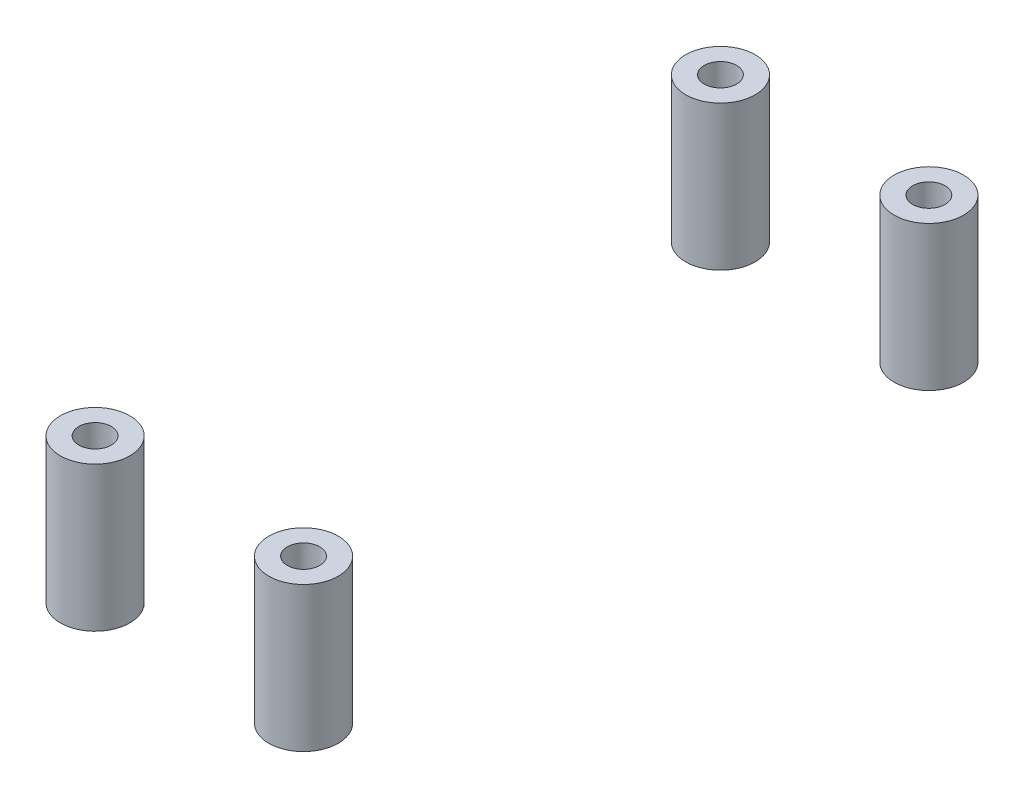
ISO-10303-21;
HEADER;
FILE_DESCRIPTION(('STEP AP214'),'2;1');
FILE_NAME('part.step','',(''),(''),'','','');
FILE_SCHEMA(('AUTOMOTIVE_DESIGN { 1 0 10303 214 1 1 1 1 }'));
ENDSEC;
DATA;
#1=APPLICATION_CONTEXT('core data for automotive mechanical design processes');
#2=APPLICATION_PROTOCOL_DEFINITION('international standard','automotive_design',2000,#1);
#3=PRODUCT_CONTEXT('',#1,'mechanical');
#4=PRODUCT('Part','Part','',(#3));
#5=PRODUCT_RELATED_PRODUCT_CATEGORY('part','',(#4));
#6=PRODUCT_DEFINITION_FORMATION('','',#4);
#7=PRODUCT_DEFINITION_CONTEXT('part definition',#1,'design');
#8=PRODUCT_DEFINITION('design','',#6,#7);
#9=PRODUCT_DEFINITION_SHAPE('','',#8);
#10=(LENGTH_UNIT() NAMED_UNIT(*) SI_UNIT(.MILLI.,.METRE.));
#11=(NAMED_UNIT(*) PLANE_ANGLE_UNIT() SI_UNIT($,.RADIAN.));
#12=(NAMED_UNIT(*) SI_UNIT($,.STERADIAN.) SOLID_ANGLE_UNIT());
#13=UNCERTAINTY_MEASURE_WITH_UNIT(LENGTH_MEASURE(1.E-05),#10,'distance_accuracy_value','');
#14=(GEOMETRIC_REPRESENTATION_CONTEXT(3) GLOBAL_UNCERTAINTY_ASSIGNED_CONTEXT((#13)) GLOBAL_UNIT_ASSIGNED_CONTEXT((#10,
#11,#12)) REPRESENTATION_CONTEXT('',''));
#15=CARTESIAN_POINT('',(0.,0.,0.));
#16=DIRECTION('',(0.,0.,1.));
#17=DIRECTION('',(1.,0.,0.));
#18=AXIS2_PLACEMENT_3D('',#15,#16,#17);
#19=CARTESIAN_POINT('',(-11.6681038898679,12.5,-20.4229131413676));
#20=DIRECTION('',(0.,-1.,0.));
#21=DIRECTION('',(0.,0.,-1.));
#22=AXIS2_PLACEMENT_3D('',#19,#20,#21);
#23=CYLINDRICAL_SURFACE('',#22,3.);
#24=CARTESIAN_POINT('',(-11.6681038898679,12.5,-20.4229131413676));
#25=DIRECTION('',(0.,1.,0.));
#26=DIRECTION('',(0.,0.,1.));
#27=AXIS2_PLACEMENT_3D('',#24,#25,#26);
#28=CIRCLE('',#27,3.);
#29=CARTESIAN_POINT('',(-11.6681038898679,12.5,-17.4229131413676));
#30=VERTEX_POINT('',#29);
#31=EDGE_CURVE('E11',#30,#30,#28,.T.);
#32=ORIENTED_EDGE('',*,*,#31,.F.);
#33=EDGE_LOOP('',(#32));
#34=FACE_BOUND('',#33,.T.);
#35=CARTESIAN_POINT('',(-11.6681038898679,0.,-20.4229131413676));
#36=DIRECTION('',(0.,1.,0.));
#37=DIRECTION('',(0.,0.,1.));
#38=AXIS2_PLACEMENT_3D('',#35,#36,#37);
#39=CIRCLE('',#38,3.);
#40=CARTESIAN_POINT('',(-11.6681038898679,0.,-17.4229131413676));
#41=VERTEX_POINT('',#40);
#42=EDGE_CURVE('E51',#41,#41,#39,.T.);
#43=ORIENTED_EDGE('',*,*,#42,.T.);
#44=EDGE_LOOP('',(#43));
#45=FACE_BOUND('',#44,.T.);
#46=ADVANCED_FACE('F48',(#34,#45),#23,.T.);
#47=CARTESIAN_POINT('',(0.,12.5,0.));
#48=DIRECTION('',(0.,1.,0.));
#49=DIRECTION('',(0.,0.,1.));
#50=AXIS2_PLACEMENT_3D('',#47,#48,#49);
#51=PLANE('',#50);
#52=CARTESIAN_POINT('',(-11.6681038898679,12.5,-20.4229131413676));
#53=DIRECTION('',(0.,1.,0.));
#54=DIRECTION('',(0.,0.,1.));
#55=AXIS2_PLACEMENT_3D('',#52,#53,#54);
#56=CIRCLE('',#55,1.4);
#57=CARTESIAN_POINT('',(-11.6681038898679,12.5,-19.0229131413676));
#58=VERTEX_POINT('',#57);
#59=EDGE_CURVE('E60',#58,#58,#56,.T.);
#60=ORIENTED_EDGE('',*,*,#59,.F.);
#61=EDGE_LOOP('',(#60));
#62=FACE_BOUND('',#61,.T.);
#63=ORIENTED_EDGE('',*,*,#31,.T.);
#64=EDGE_LOOP('',(#63));
#65=FACE_BOUND('',#64,.T.);
#66=ADVANCED_FACE('F75',(#62,#65),#51,.T.);
#67=CARTESIAN_POINT('',(0.,0.,0.));
#68=DIRECTION('',(0.,1.,0.));
#69=DIRECTION('',(0.,0.,1.));
#70=AXIS2_PLACEMENT_3D('',#67,#68,#69);
#71=PLANE('',#70);
#72=ORIENTED_EDGE('',*,*,#42,.F.);
#73=EDGE_LOOP('',(#72));
#74=FACE_BOUND('',#73,.T.);
#75=ADVANCED_FACE('F71',(#74),#71,.F.);
#76=CARTESIAN_POINT('',(-11.6681038898679,2.5,-20.4229131413676));
#77=DIRECTION('',(0.,1.,0.));
#78=DIRECTION('',(0.,0.,1.));
#79=AXIS2_PLACEMENT_3D('',#76,#77,#78);
#80=CYLINDRICAL_SURFACE('',#79,1.4);
#81=CARTESIAN_POINT('',(-11.6681038898679,2.5,-20.4229131413676));
#82=DIRECTION('',(0.,1.,0.));
#83=DIRECTION('',(0.,0.,1.));
#84=AXIS2_PLACEMENT_3D('',#81,#82,#83);
#85=CIRCLE('',#84,1.4);
#86=CARTESIAN_POINT('',(-11.6681038898679,2.5,-19.0229131413676));
#87=VERTEX_POINT('',#86);
#88=EDGE_CURVE('E58',#87,#87,#85,.T.);
#89=ORIENTED_EDGE('',*,*,#88,.F.);
#90=EDGE_LOOP('',(#89));
#91=FACE_BOUND('',#90,.T.);
#92=ORIENTED_EDGE('',*,*,#59,.T.);
#93=EDGE_LOOP('',(#92));
#94=FACE_BOUND('',#93,.T.);
#95=ADVANCED_FACE('F68',(#91,#94),#80,.F.);
#96=CARTESIAN_POINT('',(-11.6681038898679,2.5,-20.4229131413676));
#97=DIRECTION('',(0.,1.,0.));
#98=DIRECTION('',(0.,0.,1.));
#99=AXIS2_PLACEMENT_3D('',#96,#97,#98);
#100=PLANE('',#99);
#101=ORIENTED_EDGE('',*,*,#88,.T.);
#102=EDGE_LOOP('',(#101));
#103=FACE_BOUND('',#102,.T.);
#104=ADVANCED_FACE('F66',(#103),#100,.T.);
#105=CLOSED_SHELL('',(#46,#66,#75,#95,#104));
#106=MANIFOLD_SOLID_BREP('B2',#105);
#107=CARTESIAN_POINT('',(6.33189611013209,12.5,-20.4229131413676));
#108=DIRECTION('',(0.,-1.,0.));
#109=DIRECTION('',(0.,0.,-1.));
#110=AXIS2_PLACEMENT_3D('',#107,#108,#109);
#111=CYLINDRICAL_SURFACE('',#110,3.);
#112=CARTESIAN_POINT('',(6.33189611013209,12.5,-20.4229131413676));
#113=DIRECTION('',(0.,1.,0.));
#114=DIRECTION('',(0.,0.,1.));
#115=AXIS2_PLACEMENT_3D('',#112,#113,#114);
#116=CIRCLE('',#115,3.);
#117=CARTESIAN_POINT('',(6.33189611013209,12.5,-17.4229131413676));
#118=VERTEX_POINT('',#117);
#119=EDGE_CURVE('E47',#118,#118,#116,.T.);
#120=ORIENTED_EDGE('',*,*,#119,.F.);
#121=EDGE_LOOP('',(#120));
#122=FACE_BOUND('',#121,.T.);
#123=CARTESIAN_POINT('',(6.33189611013209,0.,-20.4229131413676));
#124=DIRECTION('',(0.,1.,0.));
#125=DIRECTION('',(0.,0.,1.));
#126=AXIS2_PLACEMENT_3D('',#123,#124,#125);
#127=CIRCLE('',#126,3.);
#128=CARTESIAN_POINT('',(6.33189611013209,0.,-17.4229131413676));
#129=VERTEX_POINT('',#128);
#130=EDGE_CURVE('E130',#129,#129,#127,.T.);
#131=ORIENTED_EDGE('',*,*,#130,.T.);
#132=EDGE_LOOP('',(#131));
#133=FACE_BOUND('',#132,.T.);
#134=ADVANCED_FACE('F127',(#122,#133),#111,.T.);
#135=CARTESIAN_POINT('',(0.,12.5,0.));
#136=DIRECTION('',(0.,1.,0.));
#137=DIRECTION('',(0.,0.,1.));
#138=AXIS2_PLACEMENT_3D('',#135,#136,#137);
#139=PLANE('',#138);
#140=CARTESIAN_POINT('',(6.33189611013209,12.5,-20.4229131413676));
#141=DIRECTION('',(0.,1.,0.));
#142=DIRECTION('',(0.,0.,1.));
#143=AXIS2_PLACEMENT_3D('',#140,#141,#142);
#144=CIRCLE('',#143,1.4);
#145=CARTESIAN_POINT('',(6.33189611013209,12.5,-19.0229131413676));
#146=VERTEX_POINT('',#145);
#147=EDGE_CURVE('E137',#146,#146,#144,.T.);
#148=ORIENTED_EDGE('',*,*,#147,.F.);
#149=EDGE_LOOP('',(#148));
#150=FACE_BOUND('',#149,.T.);
#151=ORIENTED_EDGE('',*,*,#119,.T.);
#152=EDGE_LOOP('',(#151));
#153=FACE_BOUND('',#152,.T.);
#154=ADVANCED_FACE('F147',(#150,#153),#139,.T.);
#155=CARTESIAN_POINT('',(0.,0.,0.));
#156=DIRECTION('',(0.,1.,0.));
#157=DIRECTION('',(0.,0.,1.));
#158=AXIS2_PLACEMENT_3D('',#155,#156,#157);
#159=PLANE('',#158);
#160=ORIENTED_EDGE('',*,*,#130,.F.);
#161=EDGE_LOOP('',(#160));
#162=FACE_BOUND('',#161,.T.);
#163=ADVANCED_FACE('F149',(#162),#159,.F.);
#164=CARTESIAN_POINT('',(6.33189611013209,2.5,-20.4229131413676));
#165=DIRECTION('',(0.,1.,0.));
#166=DIRECTION('',(0.,0.,1.));
#167=AXIS2_PLACEMENT_3D('',#164,#165,#166);
#168=CYLINDRICAL_SURFACE('',#167,1.4);
#169=CARTESIAN_POINT('',(6.33189611013209,2.5,-20.4229131413676));
#170=DIRECTION('',(0.,1.,0.));
#171=DIRECTION('',(0.,0.,1.));
#172=AXIS2_PLACEMENT_3D('',#169,#170,#171);
#173=CIRCLE('',#172,1.4);
#174=CARTESIAN_POINT('',(6.33189611013209,2.5,-19.0229131413676));
#175=VERTEX_POINT('',#174);
#176=EDGE_CURVE('E139',#175,#175,#173,.T.);
#177=ORIENTED_EDGE('',*,*,#176,.F.);
#178=EDGE_LOOP('',(#177));
#179=FACE_BOUND('',#178,.T.);
#180=ORIENTED_EDGE('',*,*,#147,.T.);
#181=EDGE_LOOP('',(#180));
#182=FACE_BOUND('',#181,.T.);
#183=ADVANCED_FACE('F145',(#179,#182),#168,.F.);
#184=CARTESIAN_POINT('',(6.33189611013209,2.5,-20.4229131413676));
#185=DIRECTION('',(0.,1.,0.));
#186=DIRECTION('',(0.,0.,1.));
#187=AXIS2_PLACEMENT_3D('',#184,#185,#186);
#188=PLANE('',#187);
#189=ORIENTED_EDGE('',*,*,#176,.T.);
#190=EDGE_LOOP('',(#189));
#191=FACE_BOUND('',#190,.T.);
#192=ADVANCED_FACE('F159',(#191),#188,.T.);
#193=CLOSED_SHELL('',(#134,#154,#163,#183,#192));
#194=MANIFOLD_SOLID_BREP('B6',#193);
#195=CARTESIAN_POINT('',(6.3318961101321,12.5,33.5770868586324));
#196=DIRECTION('',(0.,-1.,0.));
#197=DIRECTION('',(0.,0.,-1.));
#198=AXIS2_PLACEMENT_3D('',#195,#196,#197);
#199=CYLINDRICAL_SURFACE('',#198,3.);
#200=CARTESIAN_POINT('',(6.3318961101321,12.5,33.5770868586324));
#201=DIRECTION('',(0.,1.,0.));
#202=DIRECTION('',(0.,0.,1.));
#203=AXIS2_PLACEMENT_3D('',#200,#201,#202);
#204=CIRCLE('',#203,3.);
#205=CARTESIAN_POINT('',(6.3318961101321,12.5,36.5770868586324));
#206=VERTEX_POINT('',#205);
#207=EDGE_CURVE('E126',#206,#206,#204,.T.);
#208=ORIENTED_EDGE('',*,*,#207,.F.);
#209=EDGE_LOOP('',(#208));
#210=FACE_BOUND('',#209,.T.);
#211=CARTESIAN_POINT('',(6.3318961101321,0.,33.5770868586324));
#212=DIRECTION('',(0.,1.,0.));
#213=DIRECTION('',(0.,0.,1.));
#214=AXIS2_PLACEMENT_3D('',#211,#212,#213);
#215=CIRCLE('',#214,3.);
#216=CARTESIAN_POINT('',(6.3318961101321,0.,36.5770868586324));
#217=VERTEX_POINT('',#216);
#218=EDGE_CURVE('E208',#217,#217,#215,.T.);
#219=ORIENTED_EDGE('',*,*,#218,.T.);
#220=EDGE_LOOP('',(#219));
#221=FACE_BOUND('',#220,.T.);
#222=ADVANCED_FACE('F205',(#210,#221),#199,.T.);
#223=CARTESIAN_POINT('',(0.,12.5,0.));
#224=DIRECTION('',(0.,1.,0.));
#225=DIRECTION('',(0.,0.,1.));
#226=AXIS2_PLACEMENT_3D('',#223,#224,#225);
#227=PLANE('',#226);
#228=CARTESIAN_POINT('',(6.3318961101321,12.5,33.5770868586324));
#229=DIRECTION('',(0.,1.,0.));
#230=DIRECTION('',(0.,0.,1.));
#231=AXIS2_PLACEMENT_3D('',#228,#229,#230);
#232=CIRCLE('',#231,1.4);
#233=CARTESIAN_POINT('',(6.3318961101321,12.5,34.9770868586324));
#234=VERTEX_POINT('',#233);
#235=EDGE_CURVE('E215',#234,#234,#232,.T.);
#236=ORIENTED_EDGE('',*,*,#235,.F.);
#237=EDGE_LOOP('',(#236));
#238=FACE_BOUND('',#237,.T.);
#239=ORIENTED_EDGE('',*,*,#207,.T.);
#240=EDGE_LOOP('',(#239));
#241=FACE_BOUND('',#240,.T.);
#242=ADVANCED_FACE('F225',(#238,#241),#227,.T.);
#243=CARTESIAN_POINT('',(0.,0.,0.));
#244=DIRECTION('',(0.,1.,0.));
#245=DIRECTION('',(0.,0.,1.));
#246=AXIS2_PLACEMENT_3D('',#243,#244,#245);
#247=PLANE('',#246);
#248=ORIENTED_EDGE('',*,*,#218,.F.);
#249=EDGE_LOOP('',(#248));
#250=FACE_BOUND('',#249,.T.);
#251=ADVANCED_FACE('F227',(#250),#247,.F.);
#252=CARTESIAN_POINT('',(6.3318961101321,2.5,33.5770868586324));
#253=DIRECTION('',(0.,1.,0.));
#254=DIRECTION('',(0.,0.,1.));
#255=AXIS2_PLACEMENT_3D('',#252,#253,#254);
#256=CYLINDRICAL_SURFACE('',#255,1.4);
#257=CARTESIAN_POINT('',(6.3318961101321,2.5,33.5770868586324));
#258=DIRECTION('',(0.,1.,0.));
#259=DIRECTION('',(0.,0.,1.));
#260=AXIS2_PLACEMENT_3D('',#257,#258,#259);
#261=CIRCLE('',#260,1.4);
#262=CARTESIAN_POINT('',(6.3318961101321,2.5,34.9770868586324));
#263=VERTEX_POINT('',#262);
#264=EDGE_CURVE('E217',#263,#263,#261,.T.);
#265=ORIENTED_EDGE('',*,*,#264,.F.);
#266=EDGE_LOOP('',(#265));
#267=FACE_BOUND('',#266,.T.);
#268=ORIENTED_EDGE('',*,*,#235,.T.);
#269=EDGE_LOOP('',(#268));
#270=FACE_BOUND('',#269,.T.);
#271=ADVANCED_FACE('F223',(#267,#270),#256,.F.);
#272=CARTESIAN_POINT('',(6.3318961101321,2.5,33.5770868586324));
#273=DIRECTION('',(0.,1.,0.));
#274=DIRECTION('',(0.,0.,1.));
#275=AXIS2_PLACEMENT_3D('',#272,#273,#274);
#276=PLANE('',#275);
#277=ORIENTED_EDGE('',*,*,#264,.T.);
#278=EDGE_LOOP('',(#277));
#279=FACE_BOUND('',#278,.T.);
#280=ADVANCED_FACE('F237',(#279),#276,.T.);
#281=CLOSED_SHELL('',(#222,#242,#251,#271,#280));
#282=MANIFOLD_SOLID_BREP('B42',#281);
#283=CARTESIAN_POINT('',(-11.6681038898679,12.5,33.5770868586324));
#284=DIRECTION('',(0.,-1.,0.));
#285=DIRECTION('',(0.,0.,-1.));
#286=AXIS2_PLACEMENT_3D('',#283,#284,#285);
#287=CYLINDRICAL_SURFACE('',#286,3.);
#288=CARTESIAN_POINT('',(-11.6681038898679,12.5,33.5770868586324));
#289=DIRECTION('',(0.,1.,0.));
#290=DIRECTION('',(0.,0.,1.));
#291=AXIS2_PLACEMENT_3D('',#288,#289,#290);
#292=CIRCLE('',#291,3.);
#293=CARTESIAN_POINT('',(-11.6681038898679,12.5,36.5770868586324));
#294=VERTEX_POINT('',#293);
#295=EDGE_CURVE('E204',#294,#294,#292,.T.);
#296=ORIENTED_EDGE('',*,*,#295,.F.);
#297=EDGE_LOOP('',(#296));
#298=FACE_BOUND('',#297,.T.);
#299=CARTESIAN_POINT('',(-11.6681038898679,0.,33.5770868586324));
#300=DIRECTION('',(0.,1.,0.));
#301=DIRECTION('',(0.,0.,1.));
#302=AXIS2_PLACEMENT_3D('',#299,#300,#301);
#303=CIRCLE('',#302,3.);
#304=CARTESIAN_POINT('',(-11.6681038898679,0.,36.5770868586324));
#305=VERTEX_POINT('',#304);
#306=EDGE_CURVE('E279',#305,#305,#303,.T.);
#307=ORIENTED_EDGE('',*,*,#306,.T.);
#308=EDGE_LOOP('',(#307));
#309=FACE_BOUND('',#308,.T.);
#310=ADVANCED_FACE('F276',(#298,#309),#287,.T.);
#311=CARTESIAN_POINT('',(0.,12.5,0.));
#312=DIRECTION('',(0.,1.,0.));
#313=DIRECTION('',(0.,0.,1.));
#314=AXIS2_PLACEMENT_3D('',#311,#312,#313);
#315=PLANE('',#314);
#316=CARTESIAN_POINT('',(-11.6681038898679,12.5,33.5770868586324));
#317=DIRECTION('',(0.,1.,0.));
#318=DIRECTION('',(0.,0.,1.));
#319=AXIS2_PLACEMENT_3D('',#316,#317,#318);
#320=CIRCLE('',#319,1.4);
#321=CARTESIAN_POINT('',(-11.6681038898679,12.5,34.9770868586324));
#322=VERTEX_POINT('',#321);
#323=EDGE_CURVE('E286',#322,#322,#320,.T.);
#324=ORIENTED_EDGE('',*,*,#323,.F.);
#325=EDGE_LOOP('',(#324));
#326=FACE_BOUND('',#325,.T.);
#327=ORIENTED_EDGE('',*,*,#295,.T.);
#328=EDGE_LOOP('',(#327));
#329=FACE_BOUND('',#328,.T.);
#330=ADVANCED_FACE('F296',(#326,#329),#315,.T.);
#331=CARTESIAN_POINT('',(0.,0.,0.));
#332=DIRECTION('',(0.,1.,0.));
#333=DIRECTION('',(0.,0.,1.));
#334=AXIS2_PLACEMENT_3D('',#331,#332,#333);
#335=PLANE('',#334);
#336=ORIENTED_EDGE('',*,*,#306,.F.);
#337=EDGE_LOOP('',(#336));
#338=FACE_BOUND('',#337,.T.);
#339=ADVANCED_FACE('F298',(#338),#335,.F.);
#340=CARTESIAN_POINT('',(-11.6681038898679,2.5,33.5770868586324));
#341=DIRECTION('',(0.,1.,0.));
#342=DIRECTION('',(0.,0.,1.));
#343=AXIS2_PLACEMENT_3D('',#340,#341,#342);
#344=CYLINDRICAL_SURFACE('',#343,1.4);
#345=CARTESIAN_POINT('',(-11.6681038898679,2.5,33.5770868586324));
#346=DIRECTION('',(0.,1.,0.));
#347=DIRECTION('',(0.,0.,1.));
#348=AXIS2_PLACEMENT_3D('',#345,#346,#347);
#349=CIRCLE('',#348,1.4);
#350=CARTESIAN_POINT('',(-11.6681038898679,2.5,34.9770868586324));
#351=VERTEX_POINT('',#350);
#352=EDGE_CURVE('E288',#351,#351,#349,.T.);
#353=ORIENTED_EDGE('',*,*,#352,.F.);
#354=EDGE_LOOP('',(#353));
#355=FACE_BOUND('',#354,.T.);
#356=ORIENTED_EDGE('',*,*,#323,.T.);
#357=EDGE_LOOP('',(#356));
#358=FACE_BOUND('',#357,.T.);
#359=ADVANCED_FACE('F294',(#355,#358),#344,.F.);
#360=CARTESIAN_POINT('',(-11.6681038898679,2.5,33.5770868586324));
#361=DIRECTION('',(0.,1.,0.));
#362=DIRECTION('',(0.,0.,1.));
#363=AXIS2_PLACEMENT_3D('',#360,#361,#362);
#364=PLANE('',#363);
#365=ORIENTED_EDGE('',*,*,#352,.T.);
#366=EDGE_LOOP('',(#365));
#367=FACE_BOUND('',#366,.T.);
#368=ADVANCED_FACE('F308',(#367),#364,.T.);
#369=CLOSED_SHELL('',(#310,#330,#339,#359,#368));
#370=MANIFOLD_SOLID_BREP('B121',#369);
#371=ADVANCED_BREP_SHAPE_REPRESENTATION('',(#18,#106,#194,#282,#370),#14);
#372=SHAPE_DEFINITION_REPRESENTATION(#9,#371);
ENDSEC;
END-ISO-10303-21;
